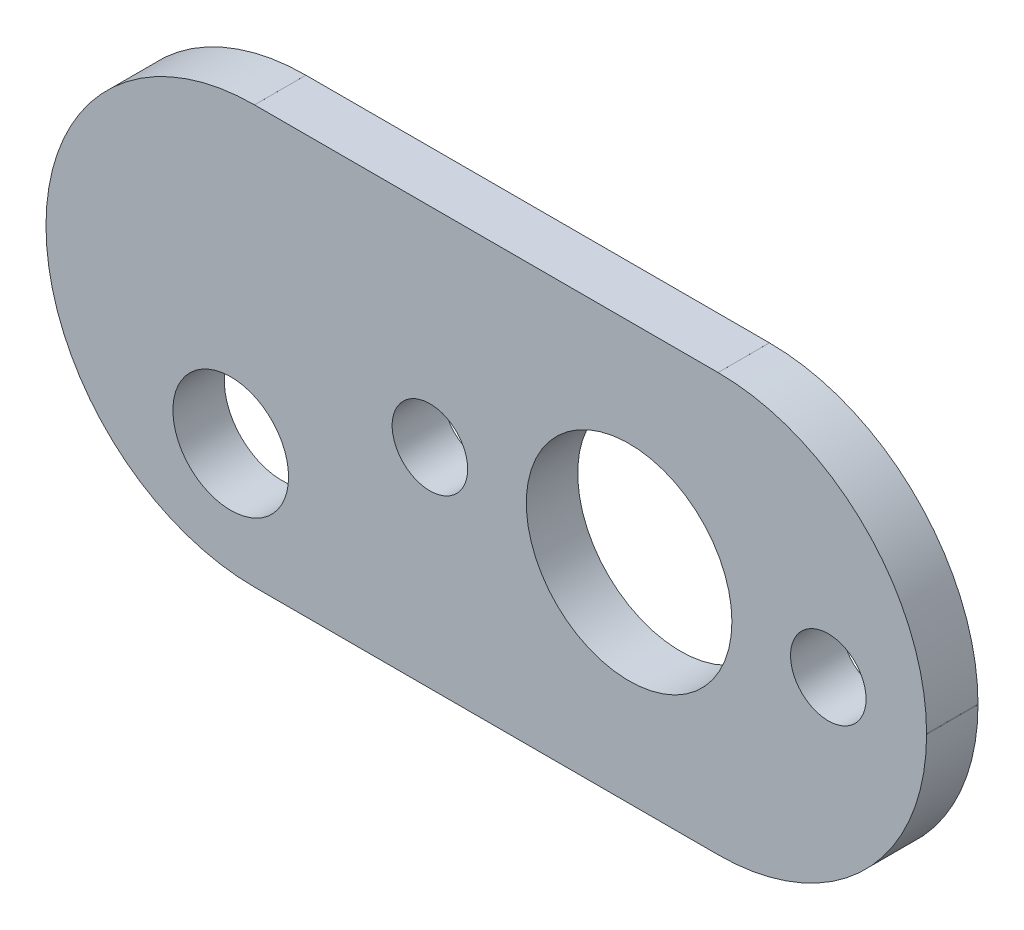
ISO-10303-21;
HEADER;
FILE_DESCRIPTION(('STEP AP214'),'2;1');
FILE_NAME('part.step','',(''),(''),'','','');
FILE_SCHEMA(('AUTOMOTIVE_DESIGN { 1 0 10303 214 1 1 1 1 }'));
ENDSEC;
DATA;
#1=APPLICATION_CONTEXT('core data for automotive mechanical design processes');
#2=APPLICATION_PROTOCOL_DEFINITION('international standard','automotive_design',2000,#1);
#3=PRODUCT_CONTEXT('',#1,'mechanical');
#4=PRODUCT('Part','Part','',(#3));
#5=PRODUCT_RELATED_PRODUCT_CATEGORY('part','',(#4));
#6=PRODUCT_DEFINITION_FORMATION('','',#4);
#7=PRODUCT_DEFINITION_CONTEXT('part definition',#1,'design');
#8=PRODUCT_DEFINITION('design','',#6,#7);
#9=PRODUCT_DEFINITION_SHAPE('','',#8);
#10=(LENGTH_UNIT() NAMED_UNIT(*) SI_UNIT(.MILLI.,.METRE.));
#11=(NAMED_UNIT(*) PLANE_ANGLE_UNIT() SI_UNIT($,.RADIAN.));
#12=(NAMED_UNIT(*) SI_UNIT($,.STERADIAN.) SOLID_ANGLE_UNIT());
#13=UNCERTAINTY_MEASURE_WITH_UNIT(LENGTH_MEASURE(1.E-05),#10,'distance_accuracy_value','');
#14=(GEOMETRIC_REPRESENTATION_CONTEXT(3) GLOBAL_UNCERTAINTY_ASSIGNED_CONTEXT((#13)) GLOBAL_UNIT_ASSIGNED_CONTEXT((#10,
#11,#12)) REPRESENTATION_CONTEXT('',''));
#15=CARTESIAN_POINT('',(0.,0.,0.));
#16=DIRECTION('',(0.,0.,1.));
#17=DIRECTION('',(1.,0.,0.));
#18=AXIS2_PLACEMENT_3D('',#15,#16,#17);
#19=CARTESIAN_POINT('',(-11.66,-6.5,1.6));
#20=DIRECTION('',(0.,0.,-1.));
#21=DIRECTION('',(-1.,0.,0.));
#22=AXIS2_PLACEMENT_3D('',#19,#20,#21);
#23=CYLINDRICAL_SURFACE('',#22,0.000300000000000387);
#24=CARTESIAN_POINT('',(-11.66,-6.5,0.));
#25=DIRECTION('',(0.,0.,1.));
#26=DIRECTION('',(1.,0.,0.));
#27=AXIS2_PLACEMENT_3D('',#24,#25,#26);
#28=CIRCLE('',#27,0.000300000000000387);
#29=CARTESIAN_POINT('',(-11.6597,-6.5,0.));
#30=VERTEX_POINT('',#29);
#31=CARTESIAN_POINT('',(-11.6603000000028,-6.49999998612066,0.));
#32=VERTEX_POINT('',#31);
#33=EDGE_CURVE('E323',#30,#32,#28,.T.);
#34=ORIENTED_EDGE('',*,*,#33,.F.);
#35=DIRECTION('',(0.,0.,-1.));
#36=VECTOR('',#35,1.);
#37=CARTESIAN_POINT('',(-11.6597,-6.5,1.6));
#38=LINE('',#37,#36);
#39=CARTESIAN_POINT('',(-11.6597,-6.5,1.6));
#40=VERTEX_POINT('',#39);
#41=EDGE_CURVE('E12',#40,#30,#38,.T.);
#42=ORIENTED_EDGE('',*,*,#41,.F.);
#43=CARTESIAN_POINT('',(-11.66,-6.5,1.6));
#44=DIRECTION('',(0.,0.,1.));
#45=DIRECTION('',(1.,0.,0.));
#46=AXIS2_PLACEMENT_3D('',#43,#44,#45);
#47=CIRCLE('',#46,0.000300000000000387);
#48=CARTESIAN_POINT('',(-11.6603000000028,-6.49999998612066,1.6));
#49=VERTEX_POINT('',#48);
#50=EDGE_CURVE('E257',#40,#49,#47,.T.);
#51=ORIENTED_EDGE('',*,*,#50,.T.);
#52=DIRECTION('',(0.,0.,-1.));
#53=VECTOR('',#52,1.);
#54=CARTESIAN_POINT('',(-11.6603000000028,-6.49999998612066,1.6));
#55=LINE('',#54,#53);
#56=EDGE_CURVE('E116',#49,#32,#55,.T.);
#57=ORIENTED_EDGE('',*,*,#56,.T.);
#58=EDGE_LOOP('',(#34,#42,#51,#57));
#59=FACE_BOUND('',#58,.T.);
#60=ADVANCED_FACE('F41',(#59),#23,.F.);
#61=CARTESIAN_POINT('',(0.,-6.5,1.6));
#62=DIRECTION('',(0.,1.,0.));
#63=DIRECTION('',(0.,0.,1.));
#64=AXIS2_PLACEMENT_3D('',#61,#62,#63);
#65=PLANE('',#64);
#66=DIRECTION('',(1.,0.,0.));
#67=VECTOR('',#66,1.);
#68=CARTESIAN_POINT('',(0.,-6.5,0.));
#69=LINE('',#68,#67);
#70=CARTESIAN_POINT('',(2.7697,-6.5,0.));
#71=VERTEX_POINT('',#70);
#72=EDGE_CURVE('E319',#30,#71,#69,.T.);
#73=ORIENTED_EDGE('',*,*,#72,.T.);
#74=DIRECTION('',(0.,0.,-1.));
#75=VECTOR('',#74,1.);
#76=CARTESIAN_POINT('',(2.7697,-6.5,1.6));
#77=LINE('',#76,#75);
#78=CARTESIAN_POINT('',(2.7697,-6.5,1.6));
#79=VERTEX_POINT('',#78);
#80=EDGE_CURVE('E50',#79,#71,#77,.T.);
#81=ORIENTED_EDGE('',*,*,#80,.F.);
#82=DIRECTION('',(1.,0.,0.));
#83=VECTOR('',#82,1.);
#84=CARTESIAN_POINT('',(0.,-6.5,1.6));
#85=LINE('',#84,#83);
#86=EDGE_CURVE('E249',#40,#79,#85,.T.);
#87=ORIENTED_EDGE('',*,*,#86,.F.);
#88=ORIENTED_EDGE('',*,*,#41,.T.);
#89=EDGE_LOOP('',(#73,#81,#87,#88));
#90=FACE_BOUND('',#89,.T.);
#91=ADVANCED_FACE('F320',(#90),#65,.F.);
#92=CARTESIAN_POINT('',(2.77,-6.5,1.6));
#93=DIRECTION('',(0.,0.,-1.));
#94=DIRECTION('',(-1.,0.,0.));
#95=AXIS2_PLACEMENT_3D('',#92,#93,#94);
#96=CYLINDRICAL_SURFACE('',#95,0.000300000000000387);
#97=CARTESIAN_POINT('',(2.77,-6.5,0.));
#98=DIRECTION('',(0.,0.,1.));
#99=DIRECTION('',(1.,0.,0.));
#100=AXIS2_PLACEMENT_3D('',#97,#98,#99);
#101=CIRCLE('',#100,0.000300000000000387);
#102=CARTESIAN_POINT('',(2.77030000000277,-6.49999998612066,0.));
#103=VERTEX_POINT('',#102);
#104=EDGE_CURVE('E315',#103,#71,#101,.T.);
#105=ORIENTED_EDGE('',*,*,#104,.F.);
#106=DIRECTION('',(0.,0.,-1.));
#107=VECTOR('',#106,1.);
#108=CARTESIAN_POINT('',(2.77030000000277,-6.49999998612066,1.6));
#109=LINE('',#108,#107);
#110=CARTESIAN_POINT('',(2.77030000000277,-6.49999998612066,1.6));
#111=VERTEX_POINT('',#110);
#112=EDGE_CURVE('E308',#111,#103,#109,.T.);
#113=ORIENTED_EDGE('',*,*,#112,.F.);
#114=CARTESIAN_POINT('',(2.77,-6.5,1.6));
#115=DIRECTION('',(0.,0.,1.));
#116=DIRECTION('',(1.,0.,0.));
#117=AXIS2_PLACEMENT_3D('',#114,#115,#116);
#118=CIRCLE('',#117,0.000300000000000387);
#119=EDGE_CURVE('E244',#111,#79,#118,.T.);
#120=ORIENTED_EDGE('',*,*,#119,.T.);
#121=ORIENTED_EDGE('',*,*,#80,.T.);
#122=EDGE_LOOP('',(#105,#113,#120,#121));
#123=FACE_BOUND('',#122,.T.);
#124=ADVANCED_FACE('F313',(#123),#96,.F.);
#125=CARTESIAN_POINT('',(2.76984973660068,-0.0098497366006773,1.6));
#126=DIRECTION('',(0.,0.,-1.));
#127=DIRECTION('',(-1.,0.,0.));
#128=AXIS2_PLACEMENT_3D('',#125,#126,#127);
#129=CYLINDRICAL_SURFACE('',#128,6.49015026513881);
#130=CARTESIAN_POINT('',(2.76984973660068,-0.0098497366006773,0.));
#131=DIRECTION('',(0.,0.,1.));
#132=DIRECTION('',(1.,0.,0.));
#133=AXIS2_PLACEMENT_3D('',#130,#131,#132);
#134=CIRCLE('',#133,6.49015026513881);
#135=CARTESIAN_POINT('',(9.2599999922879,-0.0101999999811796,0.));
#136=VERTEX_POINT('',#135);
#137=EDGE_CURVE('E329',#103,#136,#134,.T.);
#138=ORIENTED_EDGE('',*,*,#137,.T.);
#139=DIRECTION('',(0.,0.,-1.));
#140=VECTOR('',#139,1.);
#141=CARTESIAN_POINT('',(9.2599999922879,-0.0101999999811796,1.6));
#142=LINE('',#141,#140);
#143=CARTESIAN_POINT('',(9.2599999922879,-0.0101999999811796,1.6));
#144=VERTEX_POINT('',#143);
#145=EDGE_CURVE('E306',#144,#136,#142,.T.);
#146=ORIENTED_EDGE('',*,*,#145,.F.);
#147=CARTESIAN_POINT('',(2.76984973660068,-0.0098497366006773,1.6));
#148=DIRECTION('',(0.,0.,1.));
#149=DIRECTION('',(1.,0.,0.));
#150=AXIS2_PLACEMENT_3D('',#147,#148,#149);
#151=CIRCLE('',#150,6.49015026513881);
#152=EDGE_CURVE('E240',#111,#144,#151,.T.);
#153=ORIENTED_EDGE('',*,*,#152,.F.);
#154=ORIENTED_EDGE('',*,*,#112,.T.);
#155=EDGE_LOOP('',(#138,#146,#153,#154));
#156=FACE_BOUND('',#155,.T.);
#157=ADVANCED_FACE('F406',(#156),#129,.T.);
#158=CARTESIAN_POINT('',(9.26,-0.01,1.6));
#159=DIRECTION('',(0.,0.,-1.));
#160=DIRECTION('',(-1.,0.,0.));
#161=AXIS2_PLACEMENT_3D('',#158,#159,#160);
#162=CYLINDRICAL_SURFACE('',#161,0.00019999999999968);
#163=CARTESIAN_POINT('',(9.26,-0.01,0.));
#164=DIRECTION('',(0.,0.,1.));
#165=DIRECTION('',(1.,0.,0.));
#166=AXIS2_PLACEMENT_3D('',#163,#164,#165);
#167=CIRCLE('',#166,0.00019999999999968);
#168=CARTESIAN_POINT('',(9.26,-0.00980000000000032,0.));
#169=VERTEX_POINT('',#168);
#170=EDGE_CURVE('E331',#169,#136,#167,.T.);
#171=ORIENTED_EDGE('',*,*,#170,.F.);
#172=DIRECTION('',(0.,0.,-1.));
#173=VECTOR('',#172,1.);
#174=CARTESIAN_POINT('',(9.26,-0.00980000000000032,1.6));
#175=LINE('',#174,#173);
#176=CARTESIAN_POINT('',(9.26,-0.00980000000000032,1.6));
#177=VERTEX_POINT('',#176);
#178=EDGE_CURVE('E304',#177,#169,#175,.T.);
#179=ORIENTED_EDGE('',*,*,#178,.F.);
#180=CARTESIAN_POINT('',(9.26,-0.01,1.6));
#181=DIRECTION('',(0.,0.,1.));
#182=DIRECTION('',(1.,0.,0.));
#183=AXIS2_PLACEMENT_3D('',#180,#181,#182);
#184=CIRCLE('',#183,0.00019999999999968);
#185=EDGE_CURVE('E236',#177,#144,#184,.T.);
#186=ORIENTED_EDGE('',*,*,#185,.T.);
#187=ORIENTED_EDGE('',*,*,#145,.T.);
#188=EDGE_LOOP('',(#171,#179,#186,#187));
#189=FACE_BOUND('',#188,.T.);
#190=ADVANCED_FACE('F401',(#189),#162,.F.);
#191=CARTESIAN_POINT('',(9.26,-8.03176969377262E-13,1.6));
#192=DIRECTION('',(1.,0.,0.));
#193=DIRECTION('',(0.,1.,0.));
#194=AXIS2_PLACEMENT_3D('',#191,#192,#193);
#195=PLANE('',#194);
#196=DIRECTION('',(0.,-1.,0.));
#197=VECTOR('',#196,1.);
#198=CARTESIAN_POINT('',(9.26,-8.03176969377262E-13,0.));
#199=LINE('',#198,#197);
#200=CARTESIAN_POINT('',(9.26,0.00980000000000032,0.));
#201=VERTEX_POINT('',#200);
#202=EDGE_CURVE('E336',#201,#169,#199,.T.);
#203=ORIENTED_EDGE('',*,*,#202,.F.);
#204=DIRECTION('',(0.,0.,-1.));
#205=VECTOR('',#204,1.);
#206=CARTESIAN_POINT('',(9.26,0.00980000000000032,1.6));
#207=LINE('',#206,#205);
#208=CARTESIAN_POINT('',(9.26,0.00980000000000032,1.6));
#209=VERTEX_POINT('',#208);
#210=EDGE_CURVE('E302',#209,#201,#207,.T.);
#211=ORIENTED_EDGE('',*,*,#210,.F.);
#212=DIRECTION('',(0.,-1.,0.));
#213=VECTOR('',#212,1.);
#214=CARTESIAN_POINT('',(9.26,-8.03176969377262E-13,1.6));
#215=LINE('',#214,#213);
#216=EDGE_CURVE('E228',#209,#177,#215,.T.);
#217=ORIENTED_EDGE('',*,*,#216,.T.);
#218=ORIENTED_EDGE('',*,*,#178,.T.);
#219=EDGE_LOOP('',(#203,#211,#217,#218));
#220=FACE_BOUND('',#219,.T.);
#221=ADVANCED_FACE('F398',(#220),#195,.T.);
#222=CARTESIAN_POINT('',(9.26,0.01,1.6));
#223=DIRECTION('',(0.,0.,-1.));
#224=DIRECTION('',(-1.,0.,0.));
#225=AXIS2_PLACEMENT_3D('',#222,#223,#224);
#226=CYLINDRICAL_SURFACE('',#225,0.00019999999999968);
#227=CARTESIAN_POINT('',(9.26,0.01,0.));
#228=DIRECTION('',(0.,0.,1.));
#229=DIRECTION('',(1.,0.,0.));
#230=AXIS2_PLACEMENT_3D('',#227,#228,#229);
#231=CIRCLE('',#230,0.00019999999999968);
#232=CARTESIAN_POINT('',(9.2599999922879,0.010199999999851,0.));
#233=VERTEX_POINT('',#232);
#234=EDGE_CURVE('E339',#233,#201,#231,.T.);
#235=ORIENTED_EDGE('',*,*,#234,.F.);
#236=DIRECTION('',(0.,0.,-1.));
#237=VECTOR('',#236,1.);
#238=CARTESIAN_POINT('',(9.2599999922879,0.010199999999851,1.6));
#239=LINE('',#238,#237);
#240=CARTESIAN_POINT('',(9.2599999922879,0.010199999999851,1.6));
#241=VERTEX_POINT('',#240);
#242=EDGE_CURVE('E300',#241,#233,#239,.T.);
#243=ORIENTED_EDGE('',*,*,#242,.F.);
#244=CARTESIAN_POINT('',(9.26,0.01,1.6));
#245=DIRECTION('',(0.,0.,1.));
#246=DIRECTION('',(1.,0.,0.));
#247=AXIS2_PLACEMENT_3D('',#244,#245,#246);
#248=CIRCLE('',#247,0.00019999999999968);
#249=EDGE_CURVE('E223',#241,#209,#248,.T.);
#250=ORIENTED_EDGE('',*,*,#249,.T.);
#251=ORIENTED_EDGE('',*,*,#210,.T.);
#252=EDGE_LOOP('',(#235,#243,#250,#251));
#253=FACE_BOUND('',#252,.T.);
#254=ADVANCED_FACE('F393',(#253),#226,.F.);
#255=CARTESIAN_POINT('',(2.76984973660068,0.00984973660067773,1.6));
#256=DIRECTION('',(0.,0.,-1.));
#257=DIRECTION('',(-1.,0.,0.));
#258=AXIS2_PLACEMENT_3D('',#255,#256,#257);
#259=CYLINDRICAL_SURFACE('',#258,6.49015026513881);
#260=CARTESIAN_POINT('',(2.76984973660068,0.00984973660067773,0.));
#261=DIRECTION('',(0.,0.,1.));
#262=DIRECTION('',(1.,0.,0.));
#263=AXIS2_PLACEMENT_3D('',#260,#261,#262);
#264=CIRCLE('',#263,6.49015026513881);
#265=CARTESIAN_POINT('',(2.77029999998019,6.49999998612066,0.));
#266=VERTEX_POINT('',#265);
#267=EDGE_CURVE('E342',#233,#266,#264,.T.);
#268=ORIENTED_EDGE('',*,*,#267,.T.);
#269=DIRECTION('',(0.,0.,-1.));
#270=VECTOR('',#269,1.);
#271=CARTESIAN_POINT('',(2.77029999998019,6.49999998612066,1.6));
#272=LINE('',#271,#270);
#273=CARTESIAN_POINT('',(2.77029999998019,6.49999998612066,1.6));
#274=VERTEX_POINT('',#273);
#275=EDGE_CURVE('E298',#274,#266,#272,.T.);
#276=ORIENTED_EDGE('',*,*,#275,.F.);
#277=CARTESIAN_POINT('',(2.76984973660068,0.00984973660067773,1.6));
#278=DIRECTION('',(0.,0.,1.));
#279=DIRECTION('',(1.,0.,0.));
#280=AXIS2_PLACEMENT_3D('',#277,#278,#279);
#281=CIRCLE('',#280,6.49015026513881);
#282=EDGE_CURVE('E219',#241,#274,#281,.T.);
#283=ORIENTED_EDGE('',*,*,#282,.F.);
#284=ORIENTED_EDGE('',*,*,#242,.T.);
#285=EDGE_LOOP('',(#268,#276,#283,#284));
#286=FACE_BOUND('',#285,.T.);
#287=ADVANCED_FACE('F390',(#286),#259,.T.);
#288=CARTESIAN_POINT('',(2.77,6.5,1.6));
#289=DIRECTION('',(0.,0.,-1.));
#290=DIRECTION('',(-1.,0.,0.));
#291=AXIS2_PLACEMENT_3D('',#288,#289,#290);
#292=CYLINDRICAL_SURFACE('',#291,0.000300000000000387);
#293=CARTESIAN_POINT('',(2.77,6.5,0.));
#294=DIRECTION('',(0.,0.,1.));
#295=DIRECTION('',(1.,0.,0.));
#296=AXIS2_PLACEMENT_3D('',#293,#294,#295);
#297=CIRCLE('',#296,0.000300000000000387);
#298=CARTESIAN_POINT('',(2.7697,6.5,0.));
#299=VERTEX_POINT('',#298);
#300=EDGE_CURVE('E345',#299,#266,#297,.T.);
#301=ORIENTED_EDGE('',*,*,#300,.F.);
#302=DIRECTION('',(0.,0.,-1.));
#303=VECTOR('',#302,1.);
#304=CARTESIAN_POINT('',(2.7697,6.5,1.6));
#305=LINE('',#304,#303);
#306=CARTESIAN_POINT('',(2.7697,6.5,1.6));
#307=VERTEX_POINT('',#306);
#308=EDGE_CURVE('E296',#307,#299,#305,.T.);
#309=ORIENTED_EDGE('',*,*,#308,.F.);
#310=CARTESIAN_POINT('',(2.77,6.5,1.6));
#311=DIRECTION('',(0.,0.,1.));
#312=DIRECTION('',(1.,0.,0.));
#313=AXIS2_PLACEMENT_3D('',#310,#311,#312);
#314=CIRCLE('',#313,0.000300000000000387);
#315=EDGE_CURVE('E215',#307,#274,#314,.T.);
#316=ORIENTED_EDGE('',*,*,#315,.T.);
#317=ORIENTED_EDGE('',*,*,#275,.T.);
#318=EDGE_LOOP('',(#301,#309,#316,#317));
#319=FACE_BOUND('',#318,.T.);
#320=ADVANCED_FACE('F386',(#319),#292,.F.);
#321=CARTESIAN_POINT('',(0.,6.5,1.6));
#322=DIRECTION('',(0.,-1.,0.));
#323=DIRECTION('',(0.,0.,-1.));
#324=AXIS2_PLACEMENT_3D('',#321,#322,#323);
#325=PLANE('',#324);
#326=DIRECTION('',(-1.,0.,0.));
#327=VECTOR('',#326,1.);
#328=CARTESIAN_POINT('',(0.,6.5,0.));
#329=LINE('',#328,#327);
#330=CARTESIAN_POINT('',(-11.6597,6.5,0.));
#331=VERTEX_POINT('',#330);
#332=EDGE_CURVE('E348',#299,#331,#329,.T.);
#333=ORIENTED_EDGE('',*,*,#332,.T.);
#334=DIRECTION('',(0.,0.,-1.));
#335=VECTOR('',#334,1.);
#336=CARTESIAN_POINT('',(-11.6597,6.5,1.6));
#337=LINE('',#336,#335);
#338=CARTESIAN_POINT('',(-11.6597,6.5,1.6));
#339=VERTEX_POINT('',#338);
#340=EDGE_CURVE('E294',#339,#331,#337,.T.);
#341=ORIENTED_EDGE('',*,*,#340,.F.);
#342=DIRECTION('',(-1.,0.,0.));
#343=VECTOR('',#342,1.);
#344=CARTESIAN_POINT('',(0.,6.5,1.6));
#345=LINE('',#344,#343);
#346=EDGE_CURVE('E207',#307,#339,#345,.T.);
#347=ORIENTED_EDGE('',*,*,#346,.F.);
#348=ORIENTED_EDGE('',*,*,#308,.T.);
#349=EDGE_LOOP('',(#333,#341,#347,#348));
#350=FACE_BOUND('',#349,.T.);
#351=ADVANCED_FACE('F371',(#350),#325,.F.);
#352=CARTESIAN_POINT('',(-11.66,6.5,1.6));
#353=DIRECTION('',(0.,0.,-1.));
#354=DIRECTION('',(-1.,0.,0.));
#355=AXIS2_PLACEMENT_3D('',#352,#353,#354);
#356=CYLINDRICAL_SURFACE('',#355,0.000300000000000387);
#357=CARTESIAN_POINT('',(-11.66,6.5,0.));
#358=DIRECTION('',(0.,0.,1.));
#359=DIRECTION('',(1.,0.,0.));
#360=AXIS2_PLACEMENT_3D('',#357,#358,#359);
#361=CIRCLE('',#360,0.000300000000000387);
#362=CARTESIAN_POINT('',(-11.6602999999997,6.49999998612066,0.));
#363=VERTEX_POINT('',#362);
#364=EDGE_CURVE('E351',#363,#331,#361,.T.);
#365=ORIENTED_EDGE('',*,*,#364,.F.);
#366=DIRECTION('',(0.,0.,-1.));
#367=VECTOR('',#366,1.);
#368=CARTESIAN_POINT('',(-11.6602999999997,6.49999998612066,1.6));
#369=LINE('',#368,#367);
#370=CARTESIAN_POINT('',(-11.6602999999997,6.49999998612066,1.6));
#371=VERTEX_POINT('',#370);
#372=EDGE_CURVE('E292',#371,#363,#369,.T.);
#373=ORIENTED_EDGE('',*,*,#372,.F.);
#374=CARTESIAN_POINT('',(-11.66,6.5,1.6));
#375=DIRECTION('',(0.,0.,1.));
#376=DIRECTION('',(1.,0.,0.));
#377=AXIS2_PLACEMENT_3D('',#374,#375,#376);
#378=CIRCLE('',#377,0.000300000000000387);
#379=EDGE_CURVE('E202',#371,#339,#378,.T.);
#380=ORIENTED_EDGE('',*,*,#379,.T.);
#381=ORIENTED_EDGE('',*,*,#340,.T.);
#382=EDGE_LOOP('',(#365,#373,#380,#381));
#383=FACE_BOUND('',#382,.T.);
#384=ADVANCED_FACE('F375',(#383),#356,.F.);
#385=CARTESIAN_POINT('',(-11.6598497366007,0.0098497366006773,1.6));
#386=DIRECTION('',(0.,0.,-1.));
#387=DIRECTION('',(-1.,0.,0.));
#388=AXIS2_PLACEMENT_3D('',#385,#386,#387);
#389=CYLINDRICAL_SURFACE('',#388,6.49015026513881);
#390=CARTESIAN_POINT('',(-11.6598497366007,0.0098497366006773,0.));
#391=DIRECTION('',(0.,0.,1.));
#392=DIRECTION('',(1.,0.,0.));
#393=AXIS2_PLACEMENT_3D('',#390,#391,#392);
#394=CIRCLE('',#393,6.49015026513881);
#395=CARTESIAN_POINT('',(-18.1499999897066,0.0102449468599297,0.));
#396=VERTEX_POINT('',#395);
#397=EDGE_CURVE('E354',#363,#396,#394,.T.);
#398=ORIENTED_EDGE('',*,*,#397,.T.);
#399=DIRECTION('',(0.,0.,-1.));
#400=VECTOR('',#399,1.);
#401=CARTESIAN_POINT('',(-18.1499999897066,0.0102449468599297,1.6));
#402=LINE('',#401,#400);
#403=CARTESIAN_POINT('',(-18.1499999897066,0.0102449468599297,1.6));
#404=VERTEX_POINT('',#403);
#405=EDGE_CURVE('E290',#404,#396,#402,.T.);
#406=ORIENTED_EDGE('',*,*,#405,.F.);
#407=CARTESIAN_POINT('',(-11.6598497366007,0.0098497366006773,1.6));
#408=DIRECTION('',(0.,0.,1.));
#409=DIRECTION('',(1.,0.,0.));
#410=AXIS2_PLACEMENT_3D('',#407,#408,#409);
#411=CIRCLE('',#410,6.49015026513881);
#412=EDGE_CURVE('E198',#371,#404,#411,.T.);
#413=ORIENTED_EDGE('',*,*,#412,.F.);
#414=ORIENTED_EDGE('',*,*,#372,.T.);
#415=EDGE_LOOP('',(#398,#406,#413,#414));
#416=FACE_BOUND('',#415,.T.);
#417=ADVANCED_FACE('F380',(#416),#389,.T.);
#418=CARTESIAN_POINT('',(-18.15005,0.01,1.6));
#419=DIRECTION('',(0.,0.,-1.));
#420=DIRECTION('',(-1.,0.,0.));
#421=AXIS2_PLACEMENT_3D('',#418,#419,#420);
#422=CYLINDRICAL_SURFACE('',#421,0.00025000000000025);
#423=CARTESIAN_POINT('',(-18.15005,0.01,0.));
#424=DIRECTION('',(0.,0.,1.));
#425=DIRECTION('',(1.,0.,0.));
#426=AXIS2_PLACEMENT_3D('',#423,#424,#425);
#427=CIRCLE('',#426,0.00025000000000025);
#428=CARTESIAN_POINT('',(-18.15,0.00975505102572172,0.));
#429=VERTEX_POINT('',#428);
#430=EDGE_CURVE('E357',#429,#396,#427,.T.);
#431=ORIENTED_EDGE('',*,*,#430,.F.);
#432=DIRECTION('',(0.,0.,-1.));
#433=VECTOR('',#432,1.);
#434=CARTESIAN_POINT('',(-18.15,0.00975505102572172,1.6));
#435=LINE('',#434,#433);
#436=CARTESIAN_POINT('',(-18.15,0.00975505102572172,1.6));
#437=VERTEX_POINT('',#436);
#438=EDGE_CURVE('E178',#437,#429,#435,.T.);
#439=ORIENTED_EDGE('',*,*,#438,.F.);
#440=CARTESIAN_POINT('',(-18.15005,0.01,1.6));
#441=DIRECTION('',(0.,0.,1.));
#442=DIRECTION('',(1.,0.,0.));
#443=AXIS2_PLACEMENT_3D('',#440,#441,#442);
#444=CIRCLE('',#443,0.00025000000000025);
#445=EDGE_CURVE('E166',#437,#404,#444,.T.);
#446=ORIENTED_EDGE('',*,*,#445,.T.);
#447=ORIENTED_EDGE('',*,*,#405,.T.);
#448=EDGE_LOOP('',(#431,#439,#446,#447));
#449=FACE_BOUND('',#448,.T.);
#450=ADVANCED_FACE('F382',(#449),#422,.F.);
#451=CARTESIAN_POINT('',(-18.15,0.,1.6));
#452=DIRECTION('',(1.,0.,0.));
#453=DIRECTION('',(0.,0.,-1.));
#454=AXIS2_PLACEMENT_3D('',#451,#452,#453);
#455=PLANE('',#454);
#456=DIRECTION('',(0.,-1.,0.));
#457=VECTOR('',#456,1.);
#458=CARTESIAN_POINT('',(-18.15,0.,0.));
#459=LINE('',#458,#457);
#460=CARTESIAN_POINT('',(-18.15,-0.00975505102572172,0.));
#461=VERTEX_POINT('',#460);
#462=EDGE_CURVE('E174',#429,#461,#459,.T.);
#463=ORIENTED_EDGE('',*,*,#462,.T.);
#464=DIRECTION('',(0.,0.,-1.));
#465=VECTOR('',#464,1.);
#466=CARTESIAN_POINT('',(-18.15,-0.00975505102572172,1.6));
#467=LINE('',#466,#465);
#468=CARTESIAN_POINT('',(-18.15,-0.00975505102572172,1.6));
#469=VERTEX_POINT('',#468);
#470=EDGE_CURVE('E171',#469,#461,#467,.T.);
#471=ORIENTED_EDGE('',*,*,#470,.F.);
#472=DIRECTION('',(0.,-1.,0.));
#473=VECTOR('',#472,1.);
#474=CARTESIAN_POINT('',(-18.15,0.,1.6));
#475=LINE('',#474,#473);
#476=EDGE_CURVE('E159',#437,#469,#475,.T.);
#477=ORIENTED_EDGE('',*,*,#476,.F.);
#478=ORIENTED_EDGE('',*,*,#438,.T.);
#479=EDGE_LOOP('',(#463,#471,#477,#478));
#480=FACE_BOUND('',#479,.T.);
#481=ADVANCED_FACE('F172',(#480),#455,.F.);
#482=CARTESIAN_POINT('',(-18.15005,-0.01,1.6));
#483=DIRECTION('',(0.,0.,-1.));
#484=DIRECTION('',(-1.,0.,0.));
#485=AXIS2_PLACEMENT_3D('',#482,#483,#484);
#486=CYLINDRICAL_SURFACE('',#485,0.00025000000000025);
#487=CARTESIAN_POINT('',(-18.15005,-0.01,0.));
#488=DIRECTION('',(0.,0.,1.));
#489=DIRECTION('',(1.,0.,0.));
#490=AXIS2_PLACEMENT_3D('',#487,#488,#489);
#491=CIRCLE('',#490,0.00025000000000025);
#492=CARTESIAN_POINT('',(-18.1499999897066,-0.0102449468729113,0.));
#493=VERTEX_POINT('',#492);
#494=EDGE_CURVE('E283',#493,#461,#491,.T.);
#495=ORIENTED_EDGE('',*,*,#494,.F.);
#496=DIRECTION('',(0.,0.,-1.));
#497=VECTOR('',#496,1.);
#498=CARTESIAN_POINT('',(-18.1499999897066,-0.0102449468729113,1.6));
#499=LINE('',#498,#497);
#500=CARTESIAN_POINT('',(-18.1499999897066,-0.0102449468729113,1.6));
#501=VERTEX_POINT('',#500);
#502=EDGE_CURVE('E109',#501,#493,#499,.T.);
#503=ORIENTED_EDGE('',*,*,#502,.F.);
#504=CARTESIAN_POINT('',(-18.15005,-0.01,1.6));
#505=DIRECTION('',(0.,0.,1.));
#506=DIRECTION('',(1.,0.,0.));
#507=AXIS2_PLACEMENT_3D('',#504,#505,#506);
#508=CIRCLE('',#507,0.00025000000000025);
#509=EDGE_CURVE('E164',#501,#469,#508,.T.);
#510=ORIENTED_EDGE('',*,*,#509,.T.);
#511=ORIENTED_EDGE('',*,*,#470,.T.);
#512=EDGE_LOOP('',(#495,#503,#510,#511));
#513=FACE_BOUND('',#512,.T.);
#514=ADVANCED_FACE('F180',(#513),#486,.F.);
#515=CARTESIAN_POINT('',(-11.6598497366007,-0.00984973660067773,1.6));
#516=DIRECTION('',(0.,0.,-1.));
#517=DIRECTION('',(-1.,0.,0.));
#518=AXIS2_PLACEMENT_3D('',#515,#516,#517);
#519=CYLINDRICAL_SURFACE('',#518,6.49015026513881);
#520=CARTESIAN_POINT('',(-11.6598497366007,-0.00984973660067773,0.));
#521=DIRECTION('',(0.,0.,1.));
#522=DIRECTION('',(1.,0.,0.));
#523=AXIS2_PLACEMENT_3D('',#520,#521,#522);
#524=CIRCLE('',#523,6.49015026513881);
#525=EDGE_CURVE('E279',#493,#32,#524,.T.);
#526=ORIENTED_EDGE('',*,*,#525,.T.);
#527=ORIENTED_EDGE('',*,*,#56,.F.);
#528=CARTESIAN_POINT('',(-11.6598497366007,-0.00984973660067773,1.6));
#529=DIRECTION('',(0.,0.,1.));
#530=DIRECTION('',(1.,0.,0.));
#531=AXIS2_PLACEMENT_3D('',#528,#529,#530);
#532=CIRCLE('',#531,6.49015026513881);
#533=EDGE_CURVE('E58',#501,#49,#532,.T.);
#534=ORIENTED_EDGE('',*,*,#533,.F.);
#535=ORIENTED_EDGE('',*,*,#502,.T.);
#536=EDGE_LOOP('',(#526,#527,#534,#535));
#537=FACE_BOUND('',#536,.T.);
#538=ADVANCED_FACE('F361',(#537),#519,.T.);
#539=CARTESIAN_POINT('',(0.,0.,1.6));
#540=DIRECTION('',(0.,0.,-1.));
#541=DIRECTION('',(-1.,0.,0.));
#542=AXIS2_PLACEMENT_3D('',#539,#540,#541);
#543=CYLINDRICAL_SURFACE('',#542,3.2);
#544=CARTESIAN_POINT('',(0.,0.,1.6));
#545=DIRECTION('',(0.,0.,1.));
#546=DIRECTION('',(1.,0.,0.));
#547=AXIS2_PLACEMENT_3D('',#544,#545,#546);
#548=CIRCLE('',#547,3.2);
#549=CARTESIAN_POINT('',(3.2,0.,1.6));
#550=VERTEX_POINT('',#549);
#551=EDGE_CURVE('E260',#550,#550,#548,.T.);
#552=ORIENTED_EDGE('',*,*,#551,.T.);
#553=EDGE_LOOP('',(#552));
#554=FACE_BOUND('',#553,.T.);
#555=CARTESIAN_POINT('',(0.,0.,0.));
#556=DIRECTION('',(0.,0.,1.));
#557=DIRECTION('',(1.,0.,0.));
#558=AXIS2_PLACEMENT_3D('',#555,#556,#557);
#559=CIRCLE('',#558,3.2);
#560=CARTESIAN_POINT('',(3.2,0.,0.));
#561=VERTEX_POINT('',#560);
#562=EDGE_CURVE('E438',#561,#561,#559,.T.);
#563=ORIENTED_EDGE('',*,*,#562,.F.);
#564=EDGE_LOOP('',(#563));
#565=FACE_BOUND('',#564,.T.);
#566=ADVANCED_FACE('F422',(#554,#565),#543,.F.);
#567=CARTESIAN_POINT('',(-6.2,0.,1.6));
#568=DIRECTION('',(0.,0.,-1.));
#569=DIRECTION('',(-1.,0.,0.));
#570=AXIS2_PLACEMENT_3D('',#567,#568,#569);
#571=CYLINDRICAL_SURFACE('',#570,1.175);
#572=CARTESIAN_POINT('',(-6.2,0.,1.6));
#573=DIRECTION('',(0.,0.,1.));
#574=DIRECTION('',(1.,0.,0.));
#575=AXIS2_PLACEMENT_3D('',#572,#573,#574);
#576=CIRCLE('',#575,1.175);
#577=CARTESIAN_POINT('',(-5.025,0.,1.6));
#578=VERTEX_POINT('',#577);
#579=EDGE_CURVE('E265',#578,#578,#576,.T.);
#580=ORIENTED_EDGE('',*,*,#579,.T.);
#581=EDGE_LOOP('',(#580));
#582=FACE_BOUND('',#581,.T.);
#583=CARTESIAN_POINT('',(-6.2,0.,0.));
#584=DIRECTION('',(0.,0.,1.));
#585=DIRECTION('',(1.,0.,0.));
#586=AXIS2_PLACEMENT_3D('',#583,#584,#585);
#587=CIRCLE('',#586,1.175);
#588=CARTESIAN_POINT('',(-5.025,0.,0.));
#589=VERTEX_POINT('',#588);
#590=EDGE_CURVE('E436',#589,#589,#587,.T.);
#591=ORIENTED_EDGE('',*,*,#590,.F.);
#592=EDGE_LOOP('',(#591));
#593=FACE_BOUND('',#592,.T.);
#594=ADVANCED_FACE('F424',(#582,#593),#571,.F.);
#595=CARTESIAN_POINT('',(6.2,0.,1.6));
#596=DIRECTION('',(0.,0.,-1.));
#597=DIRECTION('',(-1.,0.,0.));
#598=AXIS2_PLACEMENT_3D('',#595,#596,#597);
#599=CYLINDRICAL_SURFACE('',#598,1.175);
#600=CARTESIAN_POINT('',(6.2,0.,1.6));
#601=DIRECTION('',(0.,0.,1.));
#602=DIRECTION('',(1.,0.,0.));
#603=AXIS2_PLACEMENT_3D('',#600,#601,#602);
#604=CIRCLE('',#603,1.175);
#605=CARTESIAN_POINT('',(7.375,0.,1.6));
#606=VERTEX_POINT('',#605);
#607=EDGE_CURVE('E270',#606,#606,#604,.T.);
#608=ORIENTED_EDGE('',*,*,#607,.T.);
#609=EDGE_LOOP('',(#608));
#610=FACE_BOUND('',#609,.T.);
#611=CARTESIAN_POINT('',(6.2,0.,0.));
#612=DIRECTION('',(0.,0.,1.));
#613=DIRECTION('',(1.,0.,0.));
#614=AXIS2_PLACEMENT_3D('',#611,#612,#613);
#615=CIRCLE('',#614,1.175);
#616=CARTESIAN_POINT('',(7.375,0.,0.));
#617=VERTEX_POINT('',#616);
#618=EDGE_CURVE('E439',#617,#617,#615,.T.);
#619=ORIENTED_EDGE('',*,*,#618,.F.);
#620=EDGE_LOOP('',(#619));
#621=FACE_BOUND('',#620,.T.);
#622=ADVANCED_FACE('F43',(#610,#621),#599,.F.);
#623=CARTESIAN_POINT('',(-12.4,-3.,1.6));
#624=DIRECTION('',(0.,0.,-1.));
#625=DIRECTION('',(-1.,0.,0.));
#626=AXIS2_PLACEMENT_3D('',#623,#624,#625);
#627=CYLINDRICAL_SURFACE('',#626,1.8);
#628=CARTESIAN_POINT('',(-12.4,-3.,1.6));
#629=DIRECTION('',(0.,0.,1.));
#630=DIRECTION('',(1.,0.,0.));
#631=AXIS2_PLACEMENT_3D('',#628,#629,#630);
#632=CIRCLE('',#631,1.8);
#633=CARTESIAN_POINT('',(-10.6,-3.,1.6));
#634=VERTEX_POINT('',#633);
#635=EDGE_CURVE('E184',#634,#634,#632,.T.);
#636=ORIENTED_EDGE('',*,*,#635,.T.);
#637=EDGE_LOOP('',(#636));
#638=FACE_BOUND('',#637,.T.);
#639=CARTESIAN_POINT('',(-12.4,-3.,0.));
#640=DIRECTION('',(0.,0.,1.));
#641=DIRECTION('',(1.,0.,0.));
#642=AXIS2_PLACEMENT_3D('',#639,#640,#641);
#643=CIRCLE('',#642,1.8);
#644=CARTESIAN_POINT('',(-10.6,-3.,0.));
#645=VERTEX_POINT('',#644);
#646=EDGE_CURVE('E275',#645,#645,#643,.T.);
#647=ORIENTED_EDGE('',*,*,#646,.F.);
#648=EDGE_LOOP('',(#647));
#649=FACE_BOUND('',#648,.T.);
#650=ADVANCED_FACE('F431',(#638,#649),#627,.F.);
#651=CARTESIAN_POINT('',(0.,0.,1.6));
#652=DIRECTION('',(0.,0.,1.));
#653=DIRECTION('',(1.,0.,0.));
#654=AXIS2_PLACEMENT_3D('',#651,#652,#653);
#655=PLANE('',#654);
#656=ORIENTED_EDGE('',*,*,#607,.F.);
#657=EDGE_LOOP('',(#656));
#658=FACE_BOUND('',#657,.T.);
#659=ORIENTED_EDGE('',*,*,#579,.F.);
#660=EDGE_LOOP('',(#659));
#661=FACE_BOUND('',#660,.T.);
#662=ORIENTED_EDGE('',*,*,#551,.F.);
#663=EDGE_LOOP('',(#662));
#664=FACE_BOUND('',#663,.T.);
#665=ORIENTED_EDGE('',*,*,#50,.F.);
#666=ORIENTED_EDGE('',*,*,#86,.T.);
#667=ORIENTED_EDGE('',*,*,#119,.F.);
#668=ORIENTED_EDGE('',*,*,#152,.T.);
#669=ORIENTED_EDGE('',*,*,#185,.F.);
#670=ORIENTED_EDGE('',*,*,#216,.F.);
#671=ORIENTED_EDGE('',*,*,#249,.F.);
#672=ORIENTED_EDGE('',*,*,#282,.T.);
#673=ORIENTED_EDGE('',*,*,#315,.F.);
#674=ORIENTED_EDGE('',*,*,#346,.T.);
#675=ORIENTED_EDGE('',*,*,#379,.F.);
#676=ORIENTED_EDGE('',*,*,#412,.T.);
#677=ORIENTED_EDGE('',*,*,#445,.F.);
#678=ORIENTED_EDGE('',*,*,#476,.T.);
#679=ORIENTED_EDGE('',*,*,#509,.F.);
#680=ORIENTED_EDGE('',*,*,#533,.T.);
#681=EDGE_LOOP('',(#665,#666,#667,#668,#669,#670,#671,#672,#673,#674,#675,#676,#677,#678,#679,#680));
#682=FACE_BOUND('',#681,.T.);
#683=ORIENTED_EDGE('',*,*,#635,.F.);
#684=EDGE_LOOP('',(#683));
#685=FACE_BOUND('',#684,.T.);
#686=ADVANCED_FACE('F161',(#658,#661,#664,#682,#685),#655,.T.);
#687=CARTESIAN_POINT('',(0.,0.,0.));
#688=DIRECTION('',(0.,0.,1.));
#689=DIRECTION('',(1.,0.,0.));
#690=AXIS2_PLACEMENT_3D('',#687,#688,#689);
#691=PLANE('',#690);
#692=ORIENTED_EDGE('',*,*,#618,.T.);
#693=EDGE_LOOP('',(#692));
#694=FACE_BOUND('',#693,.T.);
#695=ORIENTED_EDGE('',*,*,#590,.T.);
#696=EDGE_LOOP('',(#695));
#697=FACE_BOUND('',#696,.T.);
#698=ORIENTED_EDGE('',*,*,#562,.T.);
#699=EDGE_LOOP('',(#698));
#700=FACE_BOUND('',#699,.T.);
#701=ORIENTED_EDGE('',*,*,#33,.T.);
#702=ORIENTED_EDGE('',*,*,#525,.F.);
#703=ORIENTED_EDGE('',*,*,#494,.T.);
#704=ORIENTED_EDGE('',*,*,#462,.F.);
#705=ORIENTED_EDGE('',*,*,#430,.T.);
#706=ORIENTED_EDGE('',*,*,#397,.F.);
#707=ORIENTED_EDGE('',*,*,#364,.T.);
#708=ORIENTED_EDGE('',*,*,#332,.F.);
#709=ORIENTED_EDGE('',*,*,#300,.T.);
#710=ORIENTED_EDGE('',*,*,#267,.F.);
#711=ORIENTED_EDGE('',*,*,#234,.T.);
#712=ORIENTED_EDGE('',*,*,#202,.T.);
#713=ORIENTED_EDGE('',*,*,#170,.T.);
#714=ORIENTED_EDGE('',*,*,#137,.F.);
#715=ORIENTED_EDGE('',*,*,#104,.T.);
#716=ORIENTED_EDGE('',*,*,#72,.F.);
#717=EDGE_LOOP('',(#701,#702,#703,#704,#705,#706,#707,#708,#709,#710,#711,#712,#713,#714,#715,#716));
#718=FACE_BOUND('',#717,.T.);
#719=ORIENTED_EDGE('',*,*,#646,.T.);
#720=EDGE_LOOP('',(#719));
#721=FACE_BOUND('',#720,.T.);
#722=ADVANCED_FACE('F326',(#694,#697,#700,#718,#721),#691,.F.);
#723=CLOSED_SHELL('',(#60,#91,#124,#157,#190,#221,#254,#287,#320,#351,#384,#417,#450,#481,#514,
#538,#566,#594,#622,#650,#686,#722));
#724=MANIFOLD_SOLID_BREP('B2',#723);
#725=ADVANCED_BREP_SHAPE_REPRESENTATION('',(#18,#724),#14);
#726=SHAPE_DEFINITION_REPRESENTATION(#9,#725);
ENDSEC;
END-ISO-10303-21;
